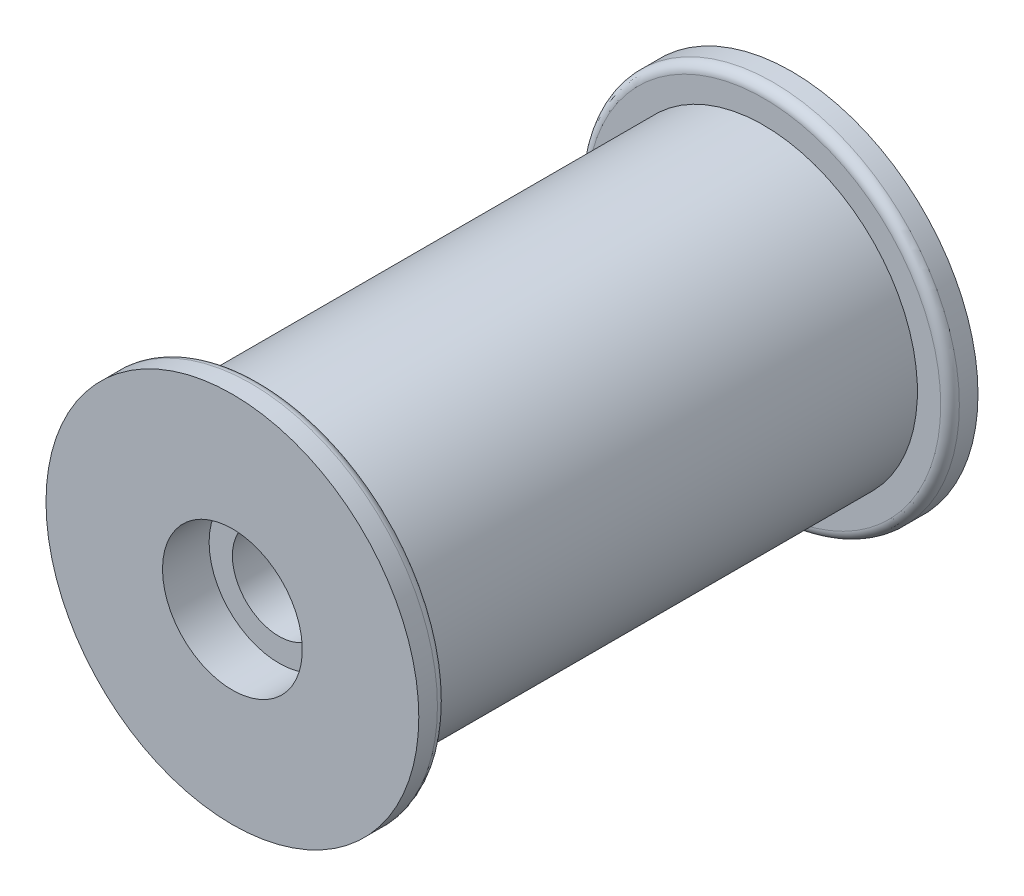
ISO-10303-21;
HEADER;
FILE_DESCRIPTION(('STEP AP214'),'2;1');
FILE_NAME('part.step','',(''),(''),'','','');
FILE_SCHEMA(('AUTOMOTIVE_DESIGN { 1 0 10303 214 1 1 1 1 }'));
ENDSEC;
DATA;
#1=APPLICATION_CONTEXT('core data for automotive mechanical design processes');
#2=APPLICATION_PROTOCOL_DEFINITION('international standard','automotive_design',2000,#1);
#3=PRODUCT_CONTEXT('',#1,'mechanical');
#4=PRODUCT('Part','Part','',(#3));
#5=PRODUCT_RELATED_PRODUCT_CATEGORY('part','',(#4));
#6=PRODUCT_DEFINITION_FORMATION('','',#4);
#7=PRODUCT_DEFINITION_CONTEXT('part definition',#1,'design');
#8=PRODUCT_DEFINITION('design','',#6,#7);
#9=PRODUCT_DEFINITION_SHAPE('','',#8);
#10=(LENGTH_UNIT() NAMED_UNIT(*) SI_UNIT(.MILLI.,.METRE.));
#11=(NAMED_UNIT(*) PLANE_ANGLE_UNIT() SI_UNIT($,.RADIAN.));
#12=(NAMED_UNIT(*) SI_UNIT($,.STERADIAN.) SOLID_ANGLE_UNIT());
#13=UNCERTAINTY_MEASURE_WITH_UNIT(LENGTH_MEASURE(1.E-05),#10,'distance_accuracy_value','');
#14=(GEOMETRIC_REPRESENTATION_CONTEXT(3) GLOBAL_UNCERTAINTY_ASSIGNED_CONTEXT((#13)) GLOBAL_UNIT_ASSIGNED_CONTEXT((#10,
#11,#12)) REPRESENTATION_CONTEXT('',''));
#15=CARTESIAN_POINT('',(0.,0.,0.));
#16=DIRECTION('',(0.,0.,1.));
#17=DIRECTION('',(1.,0.,0.));
#18=AXIS2_PLACEMENT_3D('',#15,#16,#17);
#19=CARTESIAN_POINT('',(0.,0.,55.));
#20=DIRECTION('',(0.,0.,-1.));
#21=DIRECTION('',(-1.,0.,0.));
#22=AXIS2_PLACEMENT_3D('',#19,#20,#21);
#23=PLANE('',#22);
#24=CARTESIAN_POINT('',(0.,0.,55.));
#25=DIRECTION('',(0.,0.,-1.));
#26=DIRECTION('',(-1.,0.,0.));
#27=AXIS2_PLACEMENT_3D('',#24,#25,#26);
#28=CIRCLE('',#27,7.5);
#29=CARTESIAN_POINT('',(-7.49999999999999,0.,55.));
#30=VERTEX_POINT('',#29);
#31=EDGE_CURVE('E63',#30,#30,#28,.T.);
#32=ORIENTED_EDGE('',*,*,#31,.F.);
#33=EDGE_LOOP('',(#32));
#34=FACE_BOUND('',#33,.T.);
#35=CARTESIAN_POINT('',(0.,0.,55.));
#36=DIRECTION('',(0.,0.,-1.));
#37=DIRECTION('',(-1.,0.,0.));
#38=AXIS2_PLACEMENT_3D('',#35,#36,#37);
#39=CIRCLE('',#38,5.);
#40=CARTESIAN_POINT('',(-4.99999999999999,0.,55.));
#41=VERTEX_POINT('',#40);
#42=EDGE_CURVE('E99',#41,#41,#39,.T.);
#43=ORIENTED_EDGE('',*,*,#42,.T.);
#44=EDGE_LOOP('',(#43));
#45=FACE_BOUND('',#44,.T.);
#46=ADVANCED_FACE('F39',(#34,#45),#23,.F.);
#47=CARTESIAN_POINT('',(0.,0.,0.));
#48=DIRECTION('',(0.,0.,-1.));
#49=DIRECTION('',(-1.,0.,0.));
#50=AXIS2_PLACEMENT_3D('',#47,#48,#49);
#51=CYLINDRICAL_SURFACE('',#50,7.5);
#52=CARTESIAN_POINT('',(0.,0.,60.));
#53=DIRECTION('',(0.,0.,-1.));
#54=DIRECTION('',(-1.,0.,0.));
#55=AXIS2_PLACEMENT_3D('',#52,#53,#54);
#56=CIRCLE('',#55,7.5);
#57=CARTESIAN_POINT('',(-7.49999999999999,0.,60.));
#58=VERTEX_POINT('',#57);
#59=EDGE_CURVE('E67',#58,#58,#56,.T.);
#60=ORIENTED_EDGE('',*,*,#59,.F.);
#61=EDGE_LOOP('',(#60));
#62=FACE_BOUND('',#61,.T.);
#63=ORIENTED_EDGE('',*,*,#31,.T.);
#64=EDGE_LOOP('',(#63));
#65=FACE_BOUND('',#64,.T.);
#66=ADVANCED_FACE('F140',(#62,#65),#51,.F.);
#67=CARTESIAN_POINT('',(0.,0.,60.));
#68=DIRECTION('',(0.,0.,-1.));
#69=DIRECTION('',(-1.,0.,0.));
#70=AXIS2_PLACEMENT_3D('',#67,#68,#69);
#71=PLANE('',#70);
#72=CARTESIAN_POINT('',(0.,0.,60.));
#73=DIRECTION('',(0.,0.,-1.));
#74=DIRECTION('',(-1.,0.,0.));
#75=AXIS2_PLACEMENT_3D('',#72,#73,#74);
#76=CIRCLE('',#75,20.);
#77=CARTESIAN_POINT('',(-20.,0.,60.));
#78=VERTEX_POINT('',#77);
#79=EDGE_CURVE('E71',#78,#78,#76,.T.);
#80=ORIENTED_EDGE('',*,*,#79,.F.);
#81=EDGE_LOOP('',(#80));
#82=FACE_BOUND('',#81,.T.);
#83=ORIENTED_EDGE('',*,*,#59,.T.);
#84=EDGE_LOOP('',(#83));
#85=FACE_BOUND('',#84,.T.);
#86=ADVANCED_FACE('F146',(#82,#85),#71,.F.);
#87=CARTESIAN_POINT('',(0.,0.,0.));
#88=DIRECTION('',(0.,0.,-1.));
#89=DIRECTION('',(-1.,0.,0.));
#90=AXIS2_PLACEMENT_3D('',#87,#88,#89);
#91=CYLINDRICAL_SURFACE('',#90,20.);
#92=CARTESIAN_POINT('',(0.,0.,58.));
#93=DIRECTION('',(0.,0.,1.));
#94=DIRECTION('',(1.,0.,0.));
#95=AXIS2_PLACEMENT_3D('',#92,#93,#94);
#96=CIRCLE('',#95,20.);
#97=CARTESIAN_POINT('',(20.,0.,58.));
#98=VERTEX_POINT('',#97);
#99=EDGE_CURVE('E52',#98,#98,#96,.T.);
#100=ORIENTED_EDGE('',*,*,#99,.T.);
#101=EDGE_LOOP('',(#100));
#102=FACE_BOUND('',#101,.T.);
#103=ORIENTED_EDGE('',*,*,#79,.T.);
#104=EDGE_LOOP('',(#103));
#105=FACE_BOUND('',#104,.T.);
#106=ADVANCED_FACE('F164',(#102,#105),#91,.T.);
#107=CARTESIAN_POINT('',(1.13004843577918E-13,0.,57.));
#108=DIRECTION('',(0.,0.,1.));
#109=DIRECTION('',(1.,0.,0.));
#110=AXIS2_PLACEMENT_3D('',#107,#108,#109);
#111=PLANE('',#110);
#112=CARTESIAN_POINT('',(0.,0.,57.));
#113=DIRECTION('',(0.,0.,1.));
#114=DIRECTION('',(1.,0.,0.));
#115=AXIS2_PLACEMENT_3D('',#112,#113,#114);
#116=CIRCLE('',#115,19.);
#117=CARTESIAN_POINT('',(19.,0.,57.));
#118=VERTEX_POINT('',#117);
#119=EDGE_CURVE('E57',#118,#118,#116,.F.);
#120=ORIENTED_EDGE('',*,*,#119,.T.);
#121=EDGE_LOOP('',(#120));
#122=FACE_BOUND('',#121,.T.);
#123=CARTESIAN_POINT('',(0.,0.,57.));
#124=DIRECTION('',(0.,0.,-1.));
#125=DIRECTION('',(-1.,0.,0.));
#126=AXIS2_PLACEMENT_3D('',#123,#124,#125);
#127=CIRCLE('',#126,16.5);
#128=CARTESIAN_POINT('',(-16.5,0.,57.));
#129=VERTEX_POINT('',#128);
#130=EDGE_CURVE('E75',#129,#129,#127,.T.);
#131=ORIENTED_EDGE('',*,*,#130,.F.);
#132=EDGE_LOOP('',(#131));
#133=FACE_BOUND('',#132,.T.);
#134=ADVANCED_FACE('F161',(#122,#133),#111,.F.);
#135=CARTESIAN_POINT('',(0.,0.,0.));
#136=DIRECTION('',(0.,0.,-1.));
#137=DIRECTION('',(-1.,0.,0.));
#138=AXIS2_PLACEMENT_3D('',#135,#136,#137);
#139=CYLINDRICAL_SURFACE('',#138,16.5);
#140=CARTESIAN_POINT('',(0.,0.,3.));
#141=DIRECTION('',(0.,0.,-1.));
#142=DIRECTION('',(-1.,0.,0.));
#143=AXIS2_PLACEMENT_3D('',#140,#141,#142);
#144=CIRCLE('',#143,16.5);
#145=CARTESIAN_POINT('',(-16.5,0.,3.));
#146=VERTEX_POINT('',#145);
#147=EDGE_CURVE('E79',#146,#146,#144,.T.);
#148=ORIENTED_EDGE('',*,*,#147,.F.);
#149=EDGE_LOOP('',(#148));
#150=FACE_BOUND('',#149,.T.);
#151=ORIENTED_EDGE('',*,*,#130,.T.);
#152=EDGE_LOOP('',(#151));
#153=FACE_BOUND('',#152,.T.);
#154=ADVANCED_FACE('F137',(#150,#153),#139,.T.);
#155=CARTESIAN_POINT('',(0.,0.,3.));
#156=DIRECTION('',(0.,0.,-1.));
#157=DIRECTION('',(-1.,0.,0.));
#158=AXIS2_PLACEMENT_3D('',#155,#156,#157);
#159=PLANE('',#158);
#160=CARTESIAN_POINT('',(0.,0.,3.));
#161=DIRECTION('',(0.,0.,-1.));
#162=DIRECTION('',(-1.,0.,0.));
#163=AXIS2_PLACEMENT_3D('',#160,#161,#162);
#164=CIRCLE('',#163,19.);
#165=CARTESIAN_POINT('',(-19.,0.,3.));
#166=VERTEX_POINT('',#165);
#167=EDGE_CURVE('E10',#166,#166,#164,.F.);
#168=ORIENTED_EDGE('',*,*,#167,.T.);
#169=EDGE_LOOP('',(#168));
#170=FACE_BOUND('',#169,.T.);
#171=ORIENTED_EDGE('',*,*,#147,.T.);
#172=EDGE_LOOP('',(#171));
#173=FACE_BOUND('',#172,.T.);
#174=ADVANCED_FACE('F132',(#170,#173),#159,.F.);
#175=CARTESIAN_POINT('',(0.,0.,0.));
#176=DIRECTION('',(0.,0.,-1.));
#177=DIRECTION('',(-1.,0.,0.));
#178=AXIS2_PLACEMENT_3D('',#175,#176,#177);
#179=CYLINDRICAL_SURFACE('',#178,20.);
#180=CARTESIAN_POINT('',(0.,0.,2.));
#181=DIRECTION('',(0.,0.,-1.));
#182=DIRECTION('',(-1.,0.,0.));
#183=AXIS2_PLACEMENT_3D('',#180,#181,#182);
#184=CIRCLE('',#183,20.);
#185=CARTESIAN_POINT('',(-20.,0.,2.));
#186=VERTEX_POINT('',#185);
#187=EDGE_CURVE('E47',#186,#186,#184,.T.);
#188=ORIENTED_EDGE('',*,*,#187,.T.);
#189=EDGE_LOOP('',(#188));
#190=FACE_BOUND('',#189,.T.);
#191=CARTESIAN_POINT('',(0.,0.,0.));
#192=DIRECTION('',(0.,0.,-1.));
#193=DIRECTION('',(-1.,0.,0.));
#194=AXIS2_PLACEMENT_3D('',#191,#192,#193);
#195=CIRCLE('',#194,20.);
#196=CARTESIAN_POINT('',(-20.,0.,0.));
#197=VERTEX_POINT('',#196);
#198=EDGE_CURVE('E83',#197,#197,#195,.T.);
#199=ORIENTED_EDGE('',*,*,#198,.F.);
#200=EDGE_LOOP('',(#199));
#201=FACE_BOUND('',#200,.T.);
#202=ADVANCED_FACE('F127',(#190,#201),#179,.T.);
#203=CARTESIAN_POINT('',(0.,0.,0.));
#204=DIRECTION('',(0.,0.,1.));
#205=DIRECTION('',(1.,0.,0.));
#206=AXIS2_PLACEMENT_3D('',#203,#204,#205);
#207=PLANE('',#206);
#208=CARTESIAN_POINT('',(0.,0.,0.));
#209=DIRECTION('',(0.,0.,-1.));
#210=DIRECTION('',(-1.,0.,0.));
#211=AXIS2_PLACEMENT_3D('',#208,#209,#210);
#212=CIRCLE('',#211,7.5);
#213=CARTESIAN_POINT('',(-7.5,0.,0.));
#214=VERTEX_POINT('',#213);
#215=EDGE_CURVE('E87',#214,#214,#212,.T.);
#216=ORIENTED_EDGE('',*,*,#215,.F.);
#217=EDGE_LOOP('',(#216));
#218=FACE_BOUND('',#217,.T.);
#219=ORIENTED_EDGE('',*,*,#198,.T.);
#220=EDGE_LOOP('',(#219));
#221=FACE_BOUND('',#220,.T.);
#222=ADVANCED_FACE('F121',(#218,#221),#207,.F.);
#223=CARTESIAN_POINT('',(0.,0.,0.));
#224=DIRECTION('',(0.,0.,-1.));
#225=DIRECTION('',(-1.,0.,0.));
#226=AXIS2_PLACEMENT_3D('',#223,#224,#225);
#227=CYLINDRICAL_SURFACE('',#226,7.5);
#228=CARTESIAN_POINT('',(0.,0.,5.));
#229=DIRECTION('',(0.,0.,-1.));
#230=DIRECTION('',(-1.,0.,0.));
#231=AXIS2_PLACEMENT_3D('',#228,#229,#230);
#232=CIRCLE('',#231,7.5);
#233=CARTESIAN_POINT('',(-7.5,0.,5.));
#234=VERTEX_POINT('',#233);
#235=EDGE_CURVE('E91',#234,#234,#232,.T.);
#236=ORIENTED_EDGE('',*,*,#235,.F.);
#237=EDGE_LOOP('',(#236));
#238=FACE_BOUND('',#237,.T.);
#239=ORIENTED_EDGE('',*,*,#215,.T.);
#240=EDGE_LOOP('',(#239));
#241=FACE_BOUND('',#240,.T.);
#242=ADVANCED_FACE('F115',(#238,#241),#227,.F.);
#243=CARTESIAN_POINT('',(0.,0.,5.));
#244=DIRECTION('',(0.,0.,1.));
#245=DIRECTION('',(1.,0.,0.));
#246=AXIS2_PLACEMENT_3D('',#243,#244,#245);
#247=PLANE('',#246);
#248=CARTESIAN_POINT('',(0.,0.,5.));
#249=DIRECTION('',(0.,0.,-1.));
#250=DIRECTION('',(-1.,0.,0.));
#251=AXIS2_PLACEMENT_3D('',#248,#249,#250);
#252=CIRCLE('',#251,5.);
#253=CARTESIAN_POINT('',(-5.,0.,5.));
#254=VERTEX_POINT('',#253);
#255=EDGE_CURVE('E95',#254,#254,#252,.T.);
#256=ORIENTED_EDGE('',*,*,#255,.F.);
#257=EDGE_LOOP('',(#256));
#258=FACE_BOUND('',#257,.T.);
#259=ORIENTED_EDGE('',*,*,#235,.T.);
#260=EDGE_LOOP('',(#259));
#261=FACE_BOUND('',#260,.T.);
#262=ADVANCED_FACE('F109',(#258,#261),#247,.F.);
#263=CARTESIAN_POINT('',(0.,0.,0.));
#264=DIRECTION('',(0.,0.,-1.));
#265=DIRECTION('',(-1.,0.,0.));
#266=AXIS2_PLACEMENT_3D('',#263,#264,#265);
#267=CYLINDRICAL_SURFACE('',#266,5.);
#268=ORIENTED_EDGE('',*,*,#42,.F.);
#269=EDGE_LOOP('',(#268));
#270=FACE_BOUND('',#269,.T.);
#271=ORIENTED_EDGE('',*,*,#255,.T.);
#272=EDGE_LOOP('',(#271));
#273=FACE_BOUND('',#272,.T.);
#274=ADVANCED_FACE('F105',(#270,#273),#267,.F.);
#275=CARTESIAN_POINT('',(0.,0.,58.));
#276=DIRECTION('',(0.,0.,1.));
#277=DIRECTION('',(1.,0.,0.));
#278=AXIS2_PLACEMENT_3D('',#275,#276,#277);
#279=TOROIDAL_SURFACE('',#278,19.,1.);
#280=ORIENTED_EDGE('',*,*,#99,.F.);
#281=EDGE_LOOP('',(#280));
#282=FACE_BOUND('',#281,.T.);
#283=ORIENTED_EDGE('',*,*,#119,.F.);
#284=EDGE_LOOP('',(#283));
#285=FACE_BOUND('',#284,.T.);
#286=ADVANCED_FACE('F108',(#282,#285),#279,.T.);
#287=CARTESIAN_POINT('',(0.,0.,2.));
#288=DIRECTION('',(0.,0.,-1.));
#289=DIRECTION('',(-1.,0.,0.));
#290=AXIS2_PLACEMENT_3D('',#287,#288,#289);
#291=TOROIDAL_SURFACE('',#290,19.,1.);
#292=ORIENTED_EDGE('',*,*,#167,.F.);
#293=EDGE_LOOP('',(#292));
#294=FACE_BOUND('',#293,.T.);
#295=ORIENTED_EDGE('',*,*,#187,.F.);
#296=EDGE_LOOP('',(#295));
#297=FACE_BOUND('',#296,.T.);
#298=ADVANCED_FACE('F41',(#294,#297),#291,.T.);
#299=CLOSED_SHELL('',(#46,#66,#86,#106,#134,#154,#174,#202,#222,#242,#262,#274,#286,#298));
#300=MANIFOLD_SOLID_BREP('B2',#299);
#301=ADVANCED_BREP_SHAPE_REPRESENTATION('',(#18,#300),#14);
#302=SHAPE_DEFINITION_REPRESENTATION(#9,#301);
ENDSEC;
END-ISO-10303-21;
